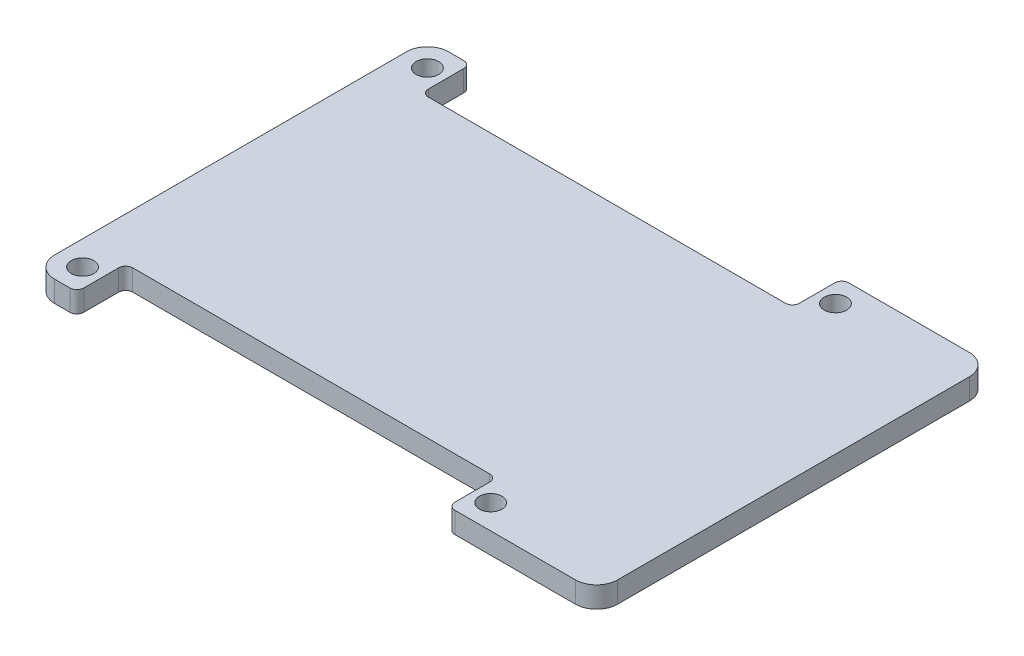
ISO-10303-21;
HEADER;
FILE_DESCRIPTION(('STEP AP214'),'2;1');
FILE_NAME('part.step','',(''),(''),'','','');
FILE_SCHEMA(('AUTOMOTIVE_DESIGN { 1 0 10303 214 1 1 1 1 }'));
ENDSEC;
DATA;
#1=APPLICATION_CONTEXT('core data for automotive mechanical design processes');
#2=APPLICATION_PROTOCOL_DEFINITION('international standard','automotive_design',2000,#1);
#3=PRODUCT_CONTEXT('',#1,'mechanical');
#4=PRODUCT('Part','Part','',(#3));
#5=PRODUCT_RELATED_PRODUCT_CATEGORY('part','',(#4));
#6=PRODUCT_DEFINITION_FORMATION('','',#4);
#7=PRODUCT_DEFINITION_CONTEXT('part definition',#1,'design');
#8=PRODUCT_DEFINITION('design','',#6,#7);
#9=PRODUCT_DEFINITION_SHAPE('','',#8);
#10=(LENGTH_UNIT() NAMED_UNIT(*) SI_UNIT(.MILLI.,.METRE.));
#11=(NAMED_UNIT(*) PLANE_ANGLE_UNIT() SI_UNIT($,.RADIAN.));
#12=(NAMED_UNIT(*) SI_UNIT($,.STERADIAN.) SOLID_ANGLE_UNIT());
#13=UNCERTAINTY_MEASURE_WITH_UNIT(LENGTH_MEASURE(1.E-05),#10,'distance_accuracy_value','');
#14=(GEOMETRIC_REPRESENTATION_CONTEXT(3) GLOBAL_UNCERTAINTY_ASSIGNED_CONTEXT((#13)) GLOBAL_UNIT_ASSIGNED_CONTEXT((#10,
#11,#12)) REPRESENTATION_CONTEXT('',''));
#15=CARTESIAN_POINT('',(0.,0.,0.));
#16=DIRECTION('',(0.,0.,1.));
#17=DIRECTION('',(1.,0.,0.));
#18=AXIS2_PLACEMENT_3D('',#15,#16,#17);
#19=CARTESIAN_POINT('',(-77.0217231267692,3.,-21.4026703774337));
#20=DIRECTION('',(0.,1.,0.));
#21=DIRECTION('',(0.,0.,1.));
#22=AXIS2_PLACEMENT_3D('',#19,#20,#21);
#23=PLANE('',#22);
#24=CARTESIAN_POINT('',(-18.5283322199872,3.,28.1136567752183));
#25=DIRECTION('',(0.,1.,0.));
#26=DIRECTION('',(0.,0.,1.));
#27=AXIS2_PLACEMENT_3D('',#24,#25,#26);
#28=CIRCLE('',#27,1.6);
#29=CARTESIAN_POINT('',(-18.5283322199872,3.,29.7136567752183));
#30=VERTEX_POINT('',#29);
#31=EDGE_CURVE('E480',#30,#30,#28,.T.);
#32=ORIENTED_EDGE('',*,*,#31,.F.);
#33=EDGE_LOOP('',(#32));
#34=FACE_BOUND('',#33,.T.);
#35=CARTESIAN_POINT('',(-76.5284846202892,3.,-20.8867242255417));
#36=DIRECTION('',(0.,1.,0.));
#37=DIRECTION('',(0.,0.,1.));
#38=AXIS2_PLACEMENT_3D('',#35,#36,#37);
#39=CIRCLE('',#38,1.6);
#40=CARTESIAN_POINT('',(-76.5284846202892,3.,-19.2867242255417));
#41=VERTEX_POINT('',#40);
#42=EDGE_CURVE('E248',#41,#41,#39,.T.);
#43=ORIENTED_EDGE('',*,*,#42,.F.);
#44=EDGE_LOOP('',(#43));
#45=FACE_BOUND('',#44,.T.);
#46=CARTESIAN_POINT('',(-77.0217231267692,3.,-21.4026703774337));
#47=DIRECTION('',(0.,1.,0.));
#48=DIRECTION('',(0.,0.,1.));
#49=AXIS2_PLACEMENT_3D('',#46,#47,#48);
#50=CIRCLE('',#49,2.98730505461);
#51=CARTESIAN_POINT('',(-77.0217231267692,3.,-24.3899754320437));
#52=VERTEX_POINT('',#51);
#53=CARTESIAN_POINT('',(-80.0090281813792,3.,-21.4026703774337));
#54=VERTEX_POINT('',#53);
#55=EDGE_CURVE('E314',#52,#54,#50,.T.);
#56=ORIENTED_EDGE('',*,*,#55,.T.);
#57=DIRECTION('',(0.,0.,1.));
#58=VECTOR('',#57,1.);
#59=CARTESIAN_POINT('',(-80.0090281813792,3.,-21.4026703774337));
#60=LINE('',#59,#58);
#61=CARTESIAN_POINT('',(-80.0090281813792,3.,28.6044314767683));
#62=VERTEX_POINT('',#61);
#63=EDGE_CURVE('E152',#54,#62,#60,.T.);
#64=ORIENTED_EDGE('',*,*,#63,.T.);
#65=CARTESIAN_POINT('',(-77.0217231267692,3.,28.6044314767683));
#66=DIRECTION('',(0.,1.,0.));
#67=DIRECTION('',(0.,0.,1.));
#68=AXIS2_PLACEMENT_3D('',#65,#66,#67);
#69=CIRCLE('',#68,2.98730505460999);
#70=CARTESIAN_POINT('',(-77.0217231267692,3.,31.5917365313783));
#71=VERTEX_POINT('',#70);
#72=EDGE_CURVE('E399',#62,#71,#69,.T.);
#73=ORIENTED_EDGE('',*,*,#72,.T.);
#74=DIRECTION('',(1.,0.,0.));
#75=VECTOR('',#74,1.);
#76=CARTESIAN_POINT('',(-77.0217231267692,3.,31.5917365313783));
#77=LINE('',#76,#75);
#78=CARTESIAN_POINT('',(-74.8747309147499,3.,31.5917365313783));
#79=VERTEX_POINT('',#78);
#80=EDGE_CURVE('E419',#71,#79,#77,.T.);
#81=ORIENTED_EDGE('',*,*,#80,.T.);
#82=CARTESIAN_POINT('',(-74.8747309147499,3.,30.5917365313783));
#83=DIRECTION('',(0.,1.,0.));
#84=DIRECTION('',(0.,0.,1.));
#85=AXIS2_PLACEMENT_3D('',#82,#83,#84);
#86=CIRCLE('',#85,1.);
#87=CARTESIAN_POINT('',(-73.8747309147499,3.,30.5917365313783));
#88=VERTEX_POINT('',#87);
#89=EDGE_CURVE('E415',#79,#88,#86,.T.);
#90=ORIENTED_EDGE('',*,*,#89,.T.);
#91=DIRECTION('',(0.,0.,-1.));
#92=VECTOR('',#91,1.);
#93=CARTESIAN_POINT('',(-73.8747309147499,3.,30.5917365313783));
#94=LINE('',#93,#92);
#95=CARTESIAN_POINT('',(-73.8747309147499,3.,25.6450286497662));
#96=VERTEX_POINT('',#95);
#97=EDGE_CURVE('E418',#88,#96,#94,.T.);
#98=ORIENTED_EDGE('',*,*,#97,.T.);
#99=CARTESIAN_POINT('',(-72.8747309147499,3.,25.6450286497662));
#100=DIRECTION('',(0.,-1.,0.));
#101=DIRECTION('',(0.,0.,-1.));
#102=AXIS2_PLACEMENT_3D('',#99,#100,#101);
#103=CIRCLE('',#102,1.);
#104=CARTESIAN_POINT('',(-72.8747309147499,3.,24.6450286497662));
#105=VERTEX_POINT('',#104);
#106=EDGE_CURVE('E424',#96,#105,#103,.T.);
#107=ORIENTED_EDGE('',*,*,#106,.T.);
#108=DIRECTION('',(1.,0.,0.));
#109=VECTOR('',#108,1.);
#110=CARTESIAN_POINT('',(-72.8747309147499,3.,24.6450286497662));
#111=LINE('',#110,#109);
#112=CARTESIAN_POINT('',(-22.1346281962434,3.,24.6450286497662));
#113=VERTEX_POINT('',#112);
#114=EDGE_CURVE('E432',#105,#113,#111,.T.);
#115=ORIENTED_EDGE('',*,*,#114,.T.);
#116=CARTESIAN_POINT('',(-22.1346281962434,3.,25.6450286497662));
#117=DIRECTION('',(0.,-1.,0.));
#118=DIRECTION('',(0.,0.,-1.));
#119=AXIS2_PLACEMENT_3D('',#116,#117,#118);
#120=CIRCLE('',#119,1.);
#121=CARTESIAN_POINT('',(-21.1346281962434,3.,25.6450286497662));
#122=VERTEX_POINT('',#121);
#123=EDGE_CURVE('E434',#113,#122,#120,.T.);
#124=ORIENTED_EDGE('',*,*,#123,.T.);
#125=DIRECTION('',(0.,0.,1.));
#126=VECTOR('',#125,1.);
#127=CARTESIAN_POINT('',(-21.1346281962434,3.,25.6450286497662));
#128=LINE('',#127,#126);
#129=CARTESIAN_POINT('',(-21.1346281962434,3.,30.5917365313783));
#130=VERTEX_POINT('',#129);
#131=EDGE_CURVE('E437',#122,#130,#128,.T.);
#132=ORIENTED_EDGE('',*,*,#131,.T.);
#133=CARTESIAN_POINT('',(-20.1346281962434,3.,30.5917365313783));
#134=DIRECTION('',(0.,1.,0.));
#135=DIRECTION('',(0.,0.,1.));
#136=AXIS2_PLACEMENT_3D('',#133,#134,#135);
#137=CIRCLE('',#136,1.);
#138=CARTESIAN_POINT('',(-20.1346281962434,3.,31.5917365313783));
#139=VERTEX_POINT('',#138);
#140=EDGE_CURVE('E440',#130,#139,#137,.T.);
#141=ORIENTED_EDGE('',*,*,#140,.T.);
#142=DIRECTION('',(1.,0.,0.));
#143=VECTOR('',#142,1.);
#144=CARTESIAN_POINT('',(-20.1346281962434,3.,31.5917365313783));
#145=LINE('',#144,#143);
#146=CARTESIAN_POINT('',(-3.00902818137926,3.,31.5917365313783));
#147=VERTEX_POINT('',#146);
#148=EDGE_CURVE('E443',#139,#147,#145,.T.);
#149=ORIENTED_EDGE('',*,*,#148,.T.);
#150=CARTESIAN_POINT('',(-3.00902818137924,3.,28.5917365313783));
#151=DIRECTION('',(0.,1.,0.));
#152=DIRECTION('',(0.,0.,-1.));
#153=AXIS2_PLACEMENT_3D('',#150,#151,#152);
#154=CIRCLE('',#153,3.);
#155=CARTESIAN_POINT('',(-0.00902818137923965,3.,28.5917365313783));
#156=VERTEX_POINT('',#155);
#157=EDGE_CURVE('E446',#147,#156,#154,.T.);
#158=ORIENTED_EDGE('',*,*,#157,.T.);
#159=DIRECTION('',(0.,0.,-1.));
#160=VECTOR('',#159,1.);
#161=CARTESIAN_POINT('',(-0.00902818137923922,3.,21.7604869984036));
#162=LINE('',#161,#160);
#163=CARTESIAN_POINT('',(-0.00902818137923922,3.,-21.3899754320436));
#164=VERTEX_POINT('',#163);
#165=EDGE_CURVE('E449',#156,#164,#162,.T.);
#166=ORIENTED_EDGE('',*,*,#165,.T.);
#167=CARTESIAN_POINT('',(-3.00902818137924,3.,-21.3899754320437));
#168=DIRECTION('',(0.,1.,0.));
#169=DIRECTION('',(0.,0.,1.));
#170=AXIS2_PLACEMENT_3D('',#167,#168,#169);
#171=CIRCLE('',#170,3.);
#172=CARTESIAN_POINT('',(-3.00902818137926,3.,-24.3899754320437));
#173=VERTEX_POINT('',#172);
#174=EDGE_CURVE('E452',#164,#173,#171,.T.);
#175=ORIENTED_EDGE('',*,*,#174,.T.);
#176=DIRECTION('',(-1.,0.,0.));
#177=VECTOR('',#176,1.);
#178=CARTESIAN_POINT('',(-3.00902818137926,3.,-24.3899754320437));
#179=LINE('',#178,#177);
#180=CARTESIAN_POINT('',(-20.1346281962434,3.,-24.3899754320437));
#181=VERTEX_POINT('',#180);
#182=EDGE_CURVE('E455',#173,#181,#179,.T.);
#183=ORIENTED_EDGE('',*,*,#182,.T.);
#184=CARTESIAN_POINT('',(-20.1346281962434,3.,-23.3899754320437));
#185=DIRECTION('',(0.,1.,0.));
#186=DIRECTION('',(0.,0.,-1.));
#187=AXIS2_PLACEMENT_3D('',#184,#185,#186);
#188=CIRCLE('',#187,1.);
#189=CARTESIAN_POINT('',(-21.1346281962434,3.,-23.3899754320437));
#190=VERTEX_POINT('',#189);
#191=EDGE_CURVE('E458',#181,#190,#188,.T.);
#192=ORIENTED_EDGE('',*,*,#191,.T.);
#193=DIRECTION('',(0.,0.,1.));
#194=VECTOR('',#193,1.);
#195=CARTESIAN_POINT('',(-21.1346281962434,3.,-23.3899754320437));
#196=LINE('',#195,#194);
#197=CARTESIAN_POINT('',(-21.1346281962434,3.,-18.3777360046756));
#198=VERTEX_POINT('',#197);
#199=EDGE_CURVE('E461',#190,#198,#196,.T.);
#200=ORIENTED_EDGE('',*,*,#199,.T.);
#201=CARTESIAN_POINT('',(-22.1346281962434,3.,-18.3777360046756));
#202=DIRECTION('',(0.,-1.,0.));
#203=DIRECTION('',(0.,0.,1.));
#204=AXIS2_PLACEMENT_3D('',#201,#202,#203);
#205=CIRCLE('',#204,1.);
#206=CARTESIAN_POINT('',(-22.1346281962434,3.,-17.3777360046756));
#207=VERTEX_POINT('',#206);
#208=EDGE_CURVE('E464',#198,#207,#205,.T.);
#209=ORIENTED_EDGE('',*,*,#208,.T.);
#210=DIRECTION('',(-1.,0.,0.));
#211=VECTOR('',#210,1.);
#212=CARTESIAN_POINT('',(-22.1346281962434,3.,-17.3777360046756));
#213=LINE('',#212,#211);
#214=CARTESIAN_POINT('',(-72.8747309147499,3.,-17.3777360046756));
#215=VERTEX_POINT('',#214);
#216=EDGE_CURVE('E467',#207,#215,#213,.T.);
#217=ORIENTED_EDGE('',*,*,#216,.T.);
#218=CARTESIAN_POINT('',(-72.8747309147499,3.,-18.3777360046756));
#219=DIRECTION('',(0.,-1.,0.));
#220=DIRECTION('',(0.,0.,1.));
#221=AXIS2_PLACEMENT_3D('',#218,#219,#220);
#222=CIRCLE('',#221,1.);
#223=CARTESIAN_POINT('',(-73.8747309147499,3.,-18.3777360046756));
#224=VERTEX_POINT('',#223);
#225=EDGE_CURVE('E219',#215,#224,#222,.T.);
#226=ORIENTED_EDGE('',*,*,#225,.T.);
#227=DIRECTION('',(0.,0.,-1.));
#228=VECTOR('',#227,1.);
#229=CARTESIAN_POINT('',(-73.8747309147499,3.,-18.3777360046756));
#230=LINE('',#229,#228);
#231=CARTESIAN_POINT('',(-73.8747309147499,3.,-23.3899754320437));
#232=VERTEX_POINT('',#231);
#233=EDGE_CURVE('E213',#224,#232,#230,.T.);
#234=ORIENTED_EDGE('',*,*,#233,.T.);
#235=CARTESIAN_POINT('',(-74.8747309147499,3.,-23.3899754320437));
#236=DIRECTION('',(0.,1.,0.));
#237=DIRECTION('',(0.,0.,-1.));
#238=AXIS2_PLACEMENT_3D('',#235,#236,#237);
#239=CIRCLE('',#238,1.);
#240=CARTESIAN_POINT('',(-74.8747309147499,3.,-24.3899754320437));
#241=VERTEX_POINT('',#240);
#242=EDGE_CURVE('E217',#232,#241,#239,.T.);
#243=ORIENTED_EDGE('',*,*,#242,.T.);
#244=DIRECTION('',(-1.,0.,0.));
#245=VECTOR('',#244,1.);
#246=CARTESIAN_POINT('',(-74.8747309147499,3.,-24.3899754320437));
#247=LINE('',#246,#245);
#248=EDGE_CURVE('E61',#241,#52,#247,.T.);
#249=ORIENTED_EDGE('',*,*,#248,.T.);
#250=EDGE_LOOP('',(#56,#64,#73,#81,#90,#98,#107,#115,#124,#132,#141,#149,#158,#166,#175,#183,
#192,#200,#209,#217,#226,#234,#243,#249));
#251=FACE_BOUND('',#250,.T.);
#252=CARTESIAN_POINT('',(-18.5285862204952,3.,-20.8865972252877));
#253=DIRECTION('',(0.,1.,0.));
#254=DIRECTION('',(0.,0.,1.));
#255=AXIS2_PLACEMENT_3D('',#252,#253,#254);
#256=CIRCLE('',#255,1.6);
#257=CARTESIAN_POINT('',(-18.5285862204952,3.,-19.2865972252877));
#258=VERTEX_POINT('',#257);
#259=EDGE_CURVE('E473',#258,#258,#256,.T.);
#260=ORIENTED_EDGE('',*,*,#259,.F.);
#261=EDGE_LOOP('',(#260));
#262=FACE_BOUND('',#261,.T.);
#263=CARTESIAN_POINT('',(-76.5283322199792,3.,28.1135297749583));
#264=DIRECTION('',(0.,1.,0.));
#265=DIRECTION('',(0.,0.,1.));
#266=AXIS2_PLACEMENT_3D('',#263,#264,#265);
#267=CIRCLE('',#266,1.6);
#268=CARTESIAN_POINT('',(-76.5283322199792,3.,29.7135297749583));
#269=VERTEX_POINT('',#268);
#270=EDGE_CURVE('E486',#269,#269,#267,.T.);
#271=ORIENTED_EDGE('',*,*,#270,.F.);
#272=EDGE_LOOP('',(#271));
#273=FACE_BOUND('',#272,.T.);
#274=ADVANCED_FACE('F43',(#34,#45,#251,#262,#273),#23,.T.);
#275=CARTESIAN_POINT('',(-77.0217231267692,0.,-21.4026703774337));
#276=DIRECTION('',(0.,1.,0.));
#277=DIRECTION('',(0.,0.,1.));
#278=AXIS2_PLACEMENT_3D('',#275,#276,#277);
#279=PLANE('',#278);
#280=CARTESIAN_POINT('',(-77.0217231267692,0.,-21.4026703774337));
#281=DIRECTION('',(0.,1.,0.));
#282=DIRECTION('',(0.,0.,1.));
#283=AXIS2_PLACEMENT_3D('',#280,#281,#282);
#284=CIRCLE('',#283,2.98730505461);
#285=CARTESIAN_POINT('',(-77.0217231267692,0.,-24.3899754320437));
#286=VERTEX_POINT('',#285);
#287=CARTESIAN_POINT('',(-80.0090281813792,0.,-21.4026703774337));
#288=VERTEX_POINT('',#287);
#289=EDGE_CURVE('E243',#286,#288,#284,.T.);
#290=ORIENTED_EDGE('',*,*,#289,.F.);
#291=DIRECTION('',(-1.,0.,0.));
#292=VECTOR('',#291,1.);
#293=CARTESIAN_POINT('',(-74.8747309147499,0.,-24.3899754320437));
#294=LINE('',#293,#292);
#295=CARTESIAN_POINT('',(-74.8747309147499,0.,-24.3899754320437));
#296=VERTEX_POINT('',#295);
#297=EDGE_CURVE('E144',#296,#286,#294,.T.);
#298=ORIENTED_EDGE('',*,*,#297,.F.);
#299=CARTESIAN_POINT('',(-74.8747309147499,0.,-23.3899754320437));
#300=DIRECTION('',(0.,1.,0.));
#301=DIRECTION('',(0.,0.,-1.));
#302=AXIS2_PLACEMENT_3D('',#299,#300,#301);
#303=CIRCLE('',#302,1.);
#304=CARTESIAN_POINT('',(-73.8747309147499,0.,-23.3899754320437));
#305=VERTEX_POINT('',#304);
#306=EDGE_CURVE('E138',#305,#296,#303,.T.);
#307=ORIENTED_EDGE('',*,*,#306,.F.);
#308=DIRECTION('',(0.,0.,-1.));
#309=VECTOR('',#308,1.);
#310=CARTESIAN_POINT('',(-73.8747309147499,0.,-18.3777360046756));
#311=LINE('',#310,#309);
#312=CARTESIAN_POINT('',(-73.8747309147499,0.,-18.3777360046756));
#313=VERTEX_POINT('',#312);
#314=EDGE_CURVE('E228',#313,#305,#311,.T.);
#315=ORIENTED_EDGE('',*,*,#314,.F.);
#316=CARTESIAN_POINT('',(-72.8747309147499,0.,-18.3777360046756));
#317=DIRECTION('',(0.,-1.,0.));
#318=DIRECTION('',(0.,0.,1.));
#319=AXIS2_PLACEMENT_3D('',#316,#317,#318);
#320=CIRCLE('',#319,1.);
#321=CARTESIAN_POINT('',(-72.8747309147499,0.,-17.3777360046756));
#322=VERTEX_POINT('',#321);
#323=EDGE_CURVE('E306',#322,#313,#320,.T.);
#324=ORIENTED_EDGE('',*,*,#323,.F.);
#325=DIRECTION('',(-1.,0.,0.));
#326=VECTOR('',#325,1.);
#327=CARTESIAN_POINT('',(-22.1346281962434,0.,-17.3777360046756));
#328=LINE('',#327,#326);
#329=CARTESIAN_POINT('',(-22.1346281962434,0.,-17.3777360046756));
#330=VERTEX_POINT('',#329);
#331=EDGE_CURVE('E303',#330,#322,#328,.T.);
#332=ORIENTED_EDGE('',*,*,#331,.F.);
#333=CARTESIAN_POINT('',(-22.1346281962434,0.,-18.3777360046756));
#334=DIRECTION('',(0.,-1.,0.));
#335=DIRECTION('',(0.,0.,1.));
#336=AXIS2_PLACEMENT_3D('',#333,#334,#335);
#337=CIRCLE('',#336,1.);
#338=CARTESIAN_POINT('',(-21.1346281962434,0.,-18.3777360046756));
#339=VERTEX_POINT('',#338);
#340=EDGE_CURVE('E300',#339,#330,#337,.T.);
#341=ORIENTED_EDGE('',*,*,#340,.F.);
#342=DIRECTION('',(0.,0.,1.));
#343=VECTOR('',#342,1.);
#344=CARTESIAN_POINT('',(-21.1346281962434,0.,-23.3899754320437));
#345=LINE('',#344,#343);
#346=CARTESIAN_POINT('',(-21.1346281962434,0.,-23.3899754320437));
#347=VERTEX_POINT('',#346);
#348=EDGE_CURVE('E297',#347,#339,#345,.T.);
#349=ORIENTED_EDGE('',*,*,#348,.F.);
#350=CARTESIAN_POINT('',(-20.1346281962434,0.,-23.3899754320437));
#351=DIRECTION('',(0.,1.,0.));
#352=DIRECTION('',(0.,0.,-1.));
#353=AXIS2_PLACEMENT_3D('',#350,#351,#352);
#354=CIRCLE('',#353,1.);
#355=CARTESIAN_POINT('',(-20.1346281962434,0.,-24.3899754320437));
#356=VERTEX_POINT('',#355);
#357=EDGE_CURVE('E294',#356,#347,#354,.T.);
#358=ORIENTED_EDGE('',*,*,#357,.F.);
#359=DIRECTION('',(-1.,0.,0.));
#360=VECTOR('',#359,1.);
#361=CARTESIAN_POINT('',(-3.00902818137926,0.,-24.3899754320437));
#362=LINE('',#361,#360);
#363=CARTESIAN_POINT('',(-3.00902818137926,0.,-24.3899754320437));
#364=VERTEX_POINT('',#363);
#365=EDGE_CURVE('E291',#364,#356,#362,.T.);
#366=ORIENTED_EDGE('',*,*,#365,.F.);
#367=CARTESIAN_POINT('',(-3.00902818137924,0.,-21.3899754320437));
#368=DIRECTION('',(0.,1.,0.));
#369=DIRECTION('',(0.,0.,1.));
#370=AXIS2_PLACEMENT_3D('',#367,#368,#369);
#371=CIRCLE('',#370,3.);
#372=CARTESIAN_POINT('',(-0.00902818137923922,0.,-21.3899754320436));
#373=VERTEX_POINT('',#372);
#374=EDGE_CURVE('E288',#373,#364,#371,.T.);
#375=ORIENTED_EDGE('',*,*,#374,.F.);
#376=DIRECTION('',(0.,0.,-1.));
#377=VECTOR('',#376,1.);
#378=CARTESIAN_POINT('',(-0.00902818137923922,0.,21.7604869984036));
#379=LINE('',#378,#377);
#380=CARTESIAN_POINT('',(-0.00902818137923965,0.,28.5917365313783));
#381=VERTEX_POINT('',#380);
#382=EDGE_CURVE('E285',#381,#373,#379,.T.);
#383=ORIENTED_EDGE('',*,*,#382,.F.);
#384=CARTESIAN_POINT('',(-3.00902818137924,0.,28.5917365313783));
#385=DIRECTION('',(0.,1.,0.));
#386=DIRECTION('',(0.,0.,-1.));
#387=AXIS2_PLACEMENT_3D('',#384,#385,#386);
#388=CIRCLE('',#387,3.);
#389=CARTESIAN_POINT('',(-3.00902818137926,0.,31.5917365313783));
#390=VERTEX_POINT('',#389);
#391=EDGE_CURVE('E281',#390,#381,#388,.T.);
#392=ORIENTED_EDGE('',*,*,#391,.F.);
#393=DIRECTION('',(1.,0.,0.));
#394=VECTOR('',#393,1.);
#395=CARTESIAN_POINT('',(-20.1346281962434,0.,31.5917365313783));
#396=LINE('',#395,#394);
#397=CARTESIAN_POINT('',(-20.1346281962434,0.,31.5917365313783));
#398=VERTEX_POINT('',#397);
#399=EDGE_CURVE('E278',#398,#390,#396,.T.);
#400=ORIENTED_EDGE('',*,*,#399,.F.);
#401=CARTESIAN_POINT('',(-20.1346281962434,0.,30.5917365313783));
#402=DIRECTION('',(0.,1.,0.));
#403=DIRECTION('',(0.,0.,1.));
#404=AXIS2_PLACEMENT_3D('',#401,#402,#403);
#405=CIRCLE('',#404,1.);
#406=CARTESIAN_POINT('',(-21.1346281962434,0.,30.5917365313783));
#407=VERTEX_POINT('',#406);
#408=EDGE_CURVE('E275',#407,#398,#405,.T.);
#409=ORIENTED_EDGE('',*,*,#408,.F.);
#410=DIRECTION('',(0.,0.,1.));
#411=VECTOR('',#410,1.);
#412=CARTESIAN_POINT('',(-21.1346281962434,0.,25.6450286497662));
#413=LINE('',#412,#411);
#414=CARTESIAN_POINT('',(-21.1346281962434,0.,25.6450286497662));
#415=VERTEX_POINT('',#414);
#416=EDGE_CURVE('E272',#415,#407,#413,.T.);
#417=ORIENTED_EDGE('',*,*,#416,.F.);
#418=CARTESIAN_POINT('',(-22.1346281962434,0.,25.6450286497662));
#419=DIRECTION('',(0.,-1.,0.));
#420=DIRECTION('',(0.,0.,-1.));
#421=AXIS2_PLACEMENT_3D('',#418,#419,#420);
#422=CIRCLE('',#421,1.);
#423=CARTESIAN_POINT('',(-22.1346281962434,0.,24.6450286497662));
#424=VERTEX_POINT('',#423);
#425=EDGE_CURVE('E269',#424,#415,#422,.T.);
#426=ORIENTED_EDGE('',*,*,#425,.F.);
#427=DIRECTION('',(1.,0.,0.));
#428=VECTOR('',#427,1.);
#429=CARTESIAN_POINT('',(-72.8747309147499,0.,24.6450286497662));
#430=LINE('',#429,#428);
#431=CARTESIAN_POINT('',(-72.8747309147499,0.,24.6450286497662));
#432=VERTEX_POINT('',#431);
#433=EDGE_CURVE('E266',#432,#424,#430,.T.);
#434=ORIENTED_EDGE('',*,*,#433,.F.);
#435=CARTESIAN_POINT('',(-72.8747309147499,0.,25.6450286497662));
#436=DIRECTION('',(0.,-1.,0.));
#437=DIRECTION('',(0.,0.,-1.));
#438=AXIS2_PLACEMENT_3D('',#435,#436,#437);
#439=CIRCLE('',#438,1.);
#440=CARTESIAN_POINT('',(-73.8747309147499,0.,25.6450286497662));
#441=VERTEX_POINT('',#440);
#442=EDGE_CURVE('E263',#441,#432,#439,.T.);
#443=ORIENTED_EDGE('',*,*,#442,.F.);
#444=DIRECTION('',(0.,0.,-1.));
#445=VECTOR('',#444,1.);
#446=CARTESIAN_POINT('',(-73.8747309147499,0.,30.5917365313783));
#447=LINE('',#446,#445);
#448=CARTESIAN_POINT('',(-73.8747309147499,0.,30.5917365313783));
#449=VERTEX_POINT('',#448);
#450=EDGE_CURVE('E260',#449,#441,#447,.T.);
#451=ORIENTED_EDGE('',*,*,#450,.F.);
#452=CARTESIAN_POINT('',(-74.8747309147499,0.,30.5917365313783));
#453=DIRECTION('',(0.,1.,0.));
#454=DIRECTION('',(0.,0.,1.));
#455=AXIS2_PLACEMENT_3D('',#452,#453,#454);
#456=CIRCLE('',#455,1.);
#457=CARTESIAN_POINT('',(-74.8747309147499,0.,31.5917365313783));
#458=VERTEX_POINT('',#457);
#459=EDGE_CURVE('E257',#458,#449,#456,.T.);
#460=ORIENTED_EDGE('',*,*,#459,.F.);
#461=DIRECTION('',(1.,0.,0.));
#462=VECTOR('',#461,1.);
#463=CARTESIAN_POINT('',(-77.0217231267692,0.,31.5917365313783));
#464=LINE('',#463,#462);
#465=CARTESIAN_POINT('',(-77.0217231267692,0.,31.5917365313783));
#466=VERTEX_POINT('',#465);
#467=EDGE_CURVE('E254',#466,#458,#464,.T.);
#468=ORIENTED_EDGE('',*,*,#467,.F.);
#469=CARTESIAN_POINT('',(-77.0217231267692,0.,28.6044314767683));
#470=DIRECTION('',(0.,1.,0.));
#471=DIRECTION('',(0.,0.,1.));
#472=AXIS2_PLACEMENT_3D('',#469,#470,#471);
#473=CIRCLE('',#472,2.98730505460999);
#474=CARTESIAN_POINT('',(-80.0090281813792,0.,28.6044314767683));
#475=VERTEX_POINT('',#474);
#476=EDGE_CURVE('E251',#475,#466,#473,.T.);
#477=ORIENTED_EDGE('',*,*,#476,.F.);
#478=DIRECTION('',(0.,0.,1.));
#479=VECTOR('',#478,1.);
#480=CARTESIAN_POINT('',(-80.0090281813792,0.,-21.4026703774337));
#481=LINE('',#480,#479);
#482=EDGE_CURVE('E247',#288,#475,#481,.T.);
#483=ORIENTED_EDGE('',*,*,#482,.F.);
#484=EDGE_LOOP('',(#290,#298,#307,#315,#324,#332,#341,#349,#358,#366,#375,#383,#392,#400,#409,
#417,#426,#434,#443,#451,#460,#468,#477,#483));
#485=FACE_BOUND('',#484,.T.);
#486=CARTESIAN_POINT('',(-76.5284846202892,0.,-20.8867242255417));
#487=DIRECTION('',(0.,1.,0.));
#488=DIRECTION('',(0.,0.,1.));
#489=AXIS2_PLACEMENT_3D('',#486,#487,#488);
#490=CIRCLE('',#489,1.6);
#491=CARTESIAN_POINT('',(-76.5284846202892,0.,-19.2867242255417));
#492=VERTEX_POINT('',#491);
#493=EDGE_CURVE('E475',#492,#492,#490,.T.);
#494=ORIENTED_EDGE('',*,*,#493,.T.);
#495=EDGE_LOOP('',(#494));
#496=FACE_BOUND('',#495,.T.);
#497=CARTESIAN_POINT('',(-18.5285862204952,0.,-20.8865972252877));
#498=DIRECTION('',(0.,1.,0.));
#499=DIRECTION('',(0.,0.,1.));
#500=AXIS2_PLACEMENT_3D('',#497,#498,#499);
#501=CIRCLE('',#500,1.6);
#502=CARTESIAN_POINT('',(-18.5285862204952,0.,-19.2865972252877));
#503=VERTEX_POINT('',#502);
#504=EDGE_CURVE('E476',#503,#503,#501,.T.);
#505=ORIENTED_EDGE('',*,*,#504,.T.);
#506=EDGE_LOOP('',(#505));
#507=FACE_BOUND('',#506,.T.);
#508=CARTESIAN_POINT('',(-18.5283322199872,0.,28.1136567752183));
#509=DIRECTION('',(0.,1.,0.));
#510=DIRECTION('',(0.,0.,1.));
#511=AXIS2_PLACEMENT_3D('',#508,#509,#510);
#512=CIRCLE('',#511,1.6);
#513=CARTESIAN_POINT('',(-18.5283322199872,0.,29.7136567752183));
#514=VERTEX_POINT('',#513);
#515=EDGE_CURVE('E490',#514,#514,#512,.T.);
#516=ORIENTED_EDGE('',*,*,#515,.T.);
#517=EDGE_LOOP('',(#516));
#518=FACE_BOUND('',#517,.T.);
#519=CARTESIAN_POINT('',(-76.5283322199792,0.,28.1135297749583));
#520=DIRECTION('',(0.,1.,0.));
#521=DIRECTION('',(0.,0.,1.));
#522=AXIS2_PLACEMENT_3D('',#519,#520,#521);
#523=CIRCLE('',#522,1.6);
#524=CARTESIAN_POINT('',(-76.5283322199792,0.,29.7135297749583));
#525=VERTEX_POINT('',#524);
#526=EDGE_CURVE('E484',#525,#525,#523,.T.);
#527=ORIENTED_EDGE('',*,*,#526,.T.);
#528=EDGE_LOOP('',(#527));
#529=FACE_BOUND('',#528,.T.);
#530=ADVANCED_FACE('F403',(#485,#496,#507,#518,#529),#279,.F.);
#531=CARTESIAN_POINT('',(-77.0217231267692,3.,-21.4026703774337));
#532=DIRECTION('',(0.,-1.,0.));
#533=DIRECTION('',(0.,0.,-1.));
#534=AXIS2_PLACEMENT_3D('',#531,#532,#533);
#535=CYLINDRICAL_SURFACE('',#534,2.98730505461);
#536=ORIENTED_EDGE('',*,*,#289,.T.);
#537=DIRECTION('',(0.,-1.,0.));
#538=VECTOR('',#537,1.);
#539=CARTESIAN_POINT('',(-80.0090281813792,3.,-21.4026703774337));
#540=LINE('',#539,#538);
#541=EDGE_CURVE('E11',#54,#288,#540,.T.);
#542=ORIENTED_EDGE('',*,*,#541,.F.);
#543=ORIENTED_EDGE('',*,*,#55,.F.);
#544=DIRECTION('',(0.,-1.,0.));
#545=VECTOR('',#544,1.);
#546=CARTESIAN_POINT('',(-77.0217231267692,3.,-24.3899754320437));
#547=LINE('',#546,#545);
#548=EDGE_CURVE('E239',#52,#286,#547,.T.);
#549=ORIENTED_EDGE('',*,*,#548,.T.);
#550=EDGE_LOOP('',(#536,#542,#543,#549));
#551=FACE_BOUND('',#550,.T.);
#552=ADVANCED_FACE('F45',(#551),#535,.T.);
#553=CARTESIAN_POINT('',(-80.0090281813792,3.,-21.4026703774337));
#554=DIRECTION('',(1.,0.,0.));
#555=DIRECTION('',(0.,0.,-1.));
#556=AXIS2_PLACEMENT_3D('',#553,#554,#555);
#557=PLANE('',#556);
#558=ORIENTED_EDGE('',*,*,#482,.T.);
#559=DIRECTION('',(0.,-1.,0.));
#560=VECTOR('',#559,1.);
#561=CARTESIAN_POINT('',(-80.0090281813792,3.,28.6044314767683));
#562=LINE('',#561,#560);
#563=EDGE_CURVE('E53',#62,#475,#562,.T.);
#564=ORIENTED_EDGE('',*,*,#563,.F.);
#565=ORIENTED_EDGE('',*,*,#63,.F.);
#566=ORIENTED_EDGE('',*,*,#541,.T.);
#567=EDGE_LOOP('',(#558,#564,#565,#566));
#568=FACE_BOUND('',#567,.T.);
#569=ADVANCED_FACE('F619',(#568),#557,.F.);
#570=CARTESIAN_POINT('',(-77.0217231267692,3.,28.6044314767683));
#571=DIRECTION('',(0.,-1.,0.));
#572=DIRECTION('',(0.,0.,-1.));
#573=AXIS2_PLACEMENT_3D('',#570,#571,#572);
#574=CYLINDRICAL_SURFACE('',#573,2.98730505460999);
#575=ORIENTED_EDGE('',*,*,#476,.T.);
#576=DIRECTION('',(0.,-1.,0.));
#577=VECTOR('',#576,1.);
#578=CARTESIAN_POINT('',(-77.0217231267692,3.,31.5917365313783));
#579=LINE('',#578,#577);
#580=EDGE_CURVE('E389',#71,#466,#579,.T.);
#581=ORIENTED_EDGE('',*,*,#580,.F.);
#582=ORIENTED_EDGE('',*,*,#72,.F.);
#583=ORIENTED_EDGE('',*,*,#563,.T.);
#584=EDGE_LOOP('',(#575,#581,#582,#583));
#585=FACE_BOUND('',#584,.T.);
#586=ADVANCED_FACE('F397',(#585),#574,.T.);
#587=CARTESIAN_POINT('',(-77.0217231267692,3.,31.5917365313783));
#588=DIRECTION('',(0.,0.,-1.));
#589=DIRECTION('',(-1.,0.,0.));
#590=AXIS2_PLACEMENT_3D('',#587,#588,#589);
#591=PLANE('',#590);
#592=ORIENTED_EDGE('',*,*,#467,.T.);
#593=DIRECTION('',(0.,-1.,0.));
#594=VECTOR('',#593,1.);
#595=CARTESIAN_POINT('',(-74.8747309147499,3.,31.5917365313783));
#596=LINE('',#595,#594);
#597=EDGE_CURVE('E385',#79,#458,#596,.T.);
#598=ORIENTED_EDGE('',*,*,#597,.F.);
#599=ORIENTED_EDGE('',*,*,#80,.F.);
#600=ORIENTED_EDGE('',*,*,#580,.T.);
#601=EDGE_LOOP('',(#592,#598,#599,#600));
#602=FACE_BOUND('',#601,.T.);
#603=ADVANCED_FACE('F409',(#602),#591,.F.);
#604=CARTESIAN_POINT('',(-74.8747309147499,3.,30.5917365313783));
#605=DIRECTION('',(0.,-1.,0.));
#606=DIRECTION('',(0.,0.,-1.));
#607=AXIS2_PLACEMENT_3D('',#604,#605,#606);
#608=CYLINDRICAL_SURFACE('',#607,1.);
#609=ORIENTED_EDGE('',*,*,#459,.T.);
#610=DIRECTION('',(0.,-1.,0.));
#611=VECTOR('',#610,1.);
#612=CARTESIAN_POINT('',(-73.8747309147499,3.,30.5917365313783));
#613=LINE('',#612,#611);
#614=EDGE_CURVE('E381',#88,#449,#613,.T.);
#615=ORIENTED_EDGE('',*,*,#614,.F.);
#616=ORIENTED_EDGE('',*,*,#89,.F.);
#617=ORIENTED_EDGE('',*,*,#597,.T.);
#618=EDGE_LOOP('',(#609,#615,#616,#617));
#619=FACE_BOUND('',#618,.T.);
#620=ADVANCED_FACE('F413',(#619),#608,.T.);
#621=CARTESIAN_POINT('',(-73.8747309147499,3.,30.5917365313783));
#622=DIRECTION('',(-1.,0.,0.));
#623=DIRECTION('',(0.,0.,1.));
#624=AXIS2_PLACEMENT_3D('',#621,#622,#623);
#625=PLANE('',#624);
#626=ORIENTED_EDGE('',*,*,#450,.T.);
#627=DIRECTION('',(0.,-1.,0.));
#628=VECTOR('',#627,1.);
#629=CARTESIAN_POINT('',(-73.8747309147499,3.,25.6450286497662));
#630=LINE('',#629,#628);
#631=EDGE_CURVE('E377',#96,#441,#630,.T.);
#632=ORIENTED_EDGE('',*,*,#631,.F.);
#633=ORIENTED_EDGE('',*,*,#97,.F.);
#634=ORIENTED_EDGE('',*,*,#614,.T.);
#635=EDGE_LOOP('',(#626,#632,#633,#634));
#636=FACE_BOUND('',#635,.T.);
#637=ADVANCED_FACE('F609',(#636),#625,.F.);
#638=CARTESIAN_POINT('',(-72.8747309147499,3.,25.6450286497662));
#639=DIRECTION('',(0.,-1.,0.));
#640=DIRECTION('',(0.,0.,-1.));
#641=AXIS2_PLACEMENT_3D('',#638,#639,#640);
#642=CYLINDRICAL_SURFACE('',#641,1.);
#643=ORIENTED_EDGE('',*,*,#442,.T.);
#644=DIRECTION('',(0.,-1.,0.));
#645=VECTOR('',#644,1.);
#646=CARTESIAN_POINT('',(-72.8747309147499,3.,24.6450286497662));
#647=LINE('',#646,#645);
#648=EDGE_CURVE('E373',#105,#432,#647,.T.);
#649=ORIENTED_EDGE('',*,*,#648,.F.);
#650=ORIENTED_EDGE('',*,*,#106,.F.);
#651=ORIENTED_EDGE('',*,*,#631,.T.);
#652=EDGE_LOOP('',(#643,#649,#650,#651));
#653=FACE_BOUND('',#652,.T.);
#654=ADVANCED_FACE('F605',(#653),#642,.F.);
#655=CARTESIAN_POINT('',(-72.8747309147499,3.,24.6450286497662));
#656=DIRECTION('',(0.,0.,-1.));
#657=DIRECTION('',(-1.,0.,0.));
#658=AXIS2_PLACEMENT_3D('',#655,#656,#657);
#659=PLANE('',#658);
#660=ORIENTED_EDGE('',*,*,#433,.T.);
#661=DIRECTION('',(0.,-1.,0.));
#662=VECTOR('',#661,1.);
#663=CARTESIAN_POINT('',(-22.1346281962434,3.,24.6450286497662));
#664=LINE('',#663,#662);
#665=EDGE_CURVE('E369',#113,#424,#664,.T.);
#666=ORIENTED_EDGE('',*,*,#665,.F.);
#667=ORIENTED_EDGE('',*,*,#114,.F.);
#668=ORIENTED_EDGE('',*,*,#648,.T.);
#669=EDGE_LOOP('',(#660,#666,#667,#668));
#670=FACE_BOUND('',#669,.T.);
#671=ADVANCED_FACE('F601',(#670),#659,.F.);
#672=CARTESIAN_POINT('',(-22.1346281962434,3.,25.6450286497662));
#673=DIRECTION('',(0.,-1.,0.));
#674=DIRECTION('',(0.,0.,-1.));
#675=AXIS2_PLACEMENT_3D('',#672,#673,#674);
#676=CYLINDRICAL_SURFACE('',#675,1.);
#677=ORIENTED_EDGE('',*,*,#425,.T.);
#678=DIRECTION('',(0.,-1.,0.));
#679=VECTOR('',#678,1.);
#680=CARTESIAN_POINT('',(-21.1346281962434,3.,25.6450286497662));
#681=LINE('',#680,#679);
#682=EDGE_CURVE('E365',#122,#415,#681,.T.);
#683=ORIENTED_EDGE('',*,*,#682,.F.);
#684=ORIENTED_EDGE('',*,*,#123,.F.);
#685=ORIENTED_EDGE('',*,*,#665,.T.);
#686=EDGE_LOOP('',(#677,#683,#684,#685));
#687=FACE_BOUND('',#686,.T.);
#688=ADVANCED_FACE('F597',(#687),#676,.F.);
#689=CARTESIAN_POINT('',(-21.1346281962434,3.,25.6450286497662));
#690=DIRECTION('',(1.,0.,0.));
#691=DIRECTION('',(0.,0.,-1.));
#692=AXIS2_PLACEMENT_3D('',#689,#690,#691);
#693=PLANE('',#692);
#694=ORIENTED_EDGE('',*,*,#416,.T.);
#695=DIRECTION('',(0.,-1.,0.));
#696=VECTOR('',#695,1.);
#697=CARTESIAN_POINT('',(-21.1346281962434,3.,30.5917365313783));
#698=LINE('',#697,#696);
#699=EDGE_CURVE('E361',#130,#407,#698,.T.);
#700=ORIENTED_EDGE('',*,*,#699,.F.);
#701=ORIENTED_EDGE('',*,*,#131,.F.);
#702=ORIENTED_EDGE('',*,*,#682,.T.);
#703=EDGE_LOOP('',(#694,#700,#701,#702));
#704=FACE_BOUND('',#703,.T.);
#705=ADVANCED_FACE('F593',(#704),#693,.F.);
#706=CARTESIAN_POINT('',(-20.1346281962434,3.,30.5917365313783));
#707=DIRECTION('',(0.,-1.,0.));
#708=DIRECTION('',(0.,0.,-1.));
#709=AXIS2_PLACEMENT_3D('',#706,#707,#708);
#710=CYLINDRICAL_SURFACE('',#709,1.);
#711=ORIENTED_EDGE('',*,*,#408,.T.);
#712=DIRECTION('',(0.,-1.,0.));
#713=VECTOR('',#712,1.);
#714=CARTESIAN_POINT('',(-20.1346281962434,3.,31.5917365313783));
#715=LINE('',#714,#713);
#716=EDGE_CURVE('E357',#139,#398,#715,.T.);
#717=ORIENTED_EDGE('',*,*,#716,.F.);
#718=ORIENTED_EDGE('',*,*,#140,.F.);
#719=ORIENTED_EDGE('',*,*,#699,.T.);
#720=EDGE_LOOP('',(#711,#717,#718,#719));
#721=FACE_BOUND('',#720,.T.);
#722=ADVANCED_FACE('F589',(#721),#710,.T.);
#723=CARTESIAN_POINT('',(-20.1346281962434,3.,31.5917365313783));
#724=DIRECTION('',(0.,0.,-1.));
#725=DIRECTION('',(-1.,0.,0.));
#726=AXIS2_PLACEMENT_3D('',#723,#724,#725);
#727=PLANE('',#726);
#728=ORIENTED_EDGE('',*,*,#399,.T.);
#729=DIRECTION('',(0.,-1.,0.));
#730=VECTOR('',#729,1.);
#731=CARTESIAN_POINT('',(-3.00902818137926,3.,31.5917365313783));
#732=LINE('',#731,#730);
#733=EDGE_CURVE('E353',#147,#390,#732,.T.);
#734=ORIENTED_EDGE('',*,*,#733,.F.);
#735=ORIENTED_EDGE('',*,*,#148,.F.);
#736=ORIENTED_EDGE('',*,*,#716,.T.);
#737=EDGE_LOOP('',(#728,#734,#735,#736));
#738=FACE_BOUND('',#737,.T.);
#739=ADVANCED_FACE('F585',(#738),#727,.F.);
#740=CARTESIAN_POINT('',(-3.00902818137924,3.,28.5917365313783));
#741=DIRECTION('',(0.,-1.,0.));
#742=DIRECTION('',(0.,0.,-1.));
#743=AXIS2_PLACEMENT_3D('',#740,#741,#742);
#744=CYLINDRICAL_SURFACE('',#743,3.);
#745=ORIENTED_EDGE('',*,*,#391,.T.);
#746=DIRECTION('',(0.,-1.,0.));
#747=VECTOR('',#746,1.);
#748=CARTESIAN_POINT('',(-0.00902818137923965,3.,28.5917365313783));
#749=LINE('',#748,#747);
#750=EDGE_CURVE('E349',#156,#381,#749,.T.);
#751=ORIENTED_EDGE('',*,*,#750,.F.);
#752=ORIENTED_EDGE('',*,*,#157,.F.);
#753=ORIENTED_EDGE('',*,*,#733,.T.);
#754=EDGE_LOOP('',(#745,#751,#752,#753));
#755=FACE_BOUND('',#754,.T.);
#756=ADVANCED_FACE('F581',(#755),#744,.T.);
#757=CARTESIAN_POINT('',(-0.00902818137923922,3.,21.7604869984036));
#758=DIRECTION('',(-1.,0.,0.));
#759=DIRECTION('',(0.,0.,1.));
#760=AXIS2_PLACEMENT_3D('',#757,#758,#759);
#761=PLANE('',#760);
#762=ORIENTED_EDGE('',*,*,#382,.T.);
#763=DIRECTION('',(0.,-1.,0.));
#764=VECTOR('',#763,1.);
#765=CARTESIAN_POINT('',(-0.00902818137923922,3.,-21.3899754320436));
#766=LINE('',#765,#764);
#767=EDGE_CURVE('E345',#164,#373,#766,.T.);
#768=ORIENTED_EDGE('',*,*,#767,.F.);
#769=ORIENTED_EDGE('',*,*,#165,.F.);
#770=ORIENTED_EDGE('',*,*,#750,.T.);
#771=EDGE_LOOP('',(#762,#768,#769,#770));
#772=FACE_BOUND('',#771,.T.);
#773=ADVANCED_FACE('F577',(#772),#761,.F.);
#774=CARTESIAN_POINT('',(-3.00902818137924,3.,-21.3899754320437));
#775=DIRECTION('',(0.,-1.,0.));
#776=DIRECTION('',(0.,0.,-1.));
#777=AXIS2_PLACEMENT_3D('',#774,#775,#776);
#778=CYLINDRICAL_SURFACE('',#777,3.);
#779=ORIENTED_EDGE('',*,*,#374,.T.);
#780=DIRECTION('',(0.,-1.,0.));
#781=VECTOR('',#780,1.);
#782=CARTESIAN_POINT('',(-3.00902818137926,3.,-24.3899754320437));
#783=LINE('',#782,#781);
#784=EDGE_CURVE('E341',#173,#364,#783,.T.);
#785=ORIENTED_EDGE('',*,*,#784,.F.);
#786=ORIENTED_EDGE('',*,*,#174,.F.);
#787=ORIENTED_EDGE('',*,*,#767,.T.);
#788=EDGE_LOOP('',(#779,#785,#786,#787));
#789=FACE_BOUND('',#788,.T.);
#790=ADVANCED_FACE('F573',(#789),#778,.T.);
#791=CARTESIAN_POINT('',(-3.00902818137926,3.,-24.3899754320437));
#792=DIRECTION('',(0.,0.,1.));
#793=DIRECTION('',(1.,0.,0.));
#794=AXIS2_PLACEMENT_3D('',#791,#792,#793);
#795=PLANE('',#794);
#796=ORIENTED_EDGE('',*,*,#365,.T.);
#797=DIRECTION('',(0.,-1.,0.));
#798=VECTOR('',#797,1.);
#799=CARTESIAN_POINT('',(-20.1346281962434,3.,-24.3899754320437));
#800=LINE('',#799,#798);
#801=EDGE_CURVE('E337',#181,#356,#800,.T.);
#802=ORIENTED_EDGE('',*,*,#801,.F.);
#803=ORIENTED_EDGE('',*,*,#182,.F.);
#804=ORIENTED_EDGE('',*,*,#784,.T.);
#805=EDGE_LOOP('',(#796,#802,#803,#804));
#806=FACE_BOUND('',#805,.T.);
#807=ADVANCED_FACE('F569',(#806),#795,.F.);
#808=CARTESIAN_POINT('',(-20.1346281962434,3.,-23.3899754320437));
#809=DIRECTION('',(0.,-1.,0.));
#810=DIRECTION('',(0.,0.,-1.));
#811=AXIS2_PLACEMENT_3D('',#808,#809,#810);
#812=CYLINDRICAL_SURFACE('',#811,1.);
#813=ORIENTED_EDGE('',*,*,#357,.T.);
#814=DIRECTION('',(0.,-1.,0.));
#815=VECTOR('',#814,1.);
#816=CARTESIAN_POINT('',(-21.1346281962434,3.,-23.3899754320437));
#817=LINE('',#816,#815);
#818=EDGE_CURVE('E333',#190,#347,#817,.T.);
#819=ORIENTED_EDGE('',*,*,#818,.F.);
#820=ORIENTED_EDGE('',*,*,#191,.F.);
#821=ORIENTED_EDGE('',*,*,#801,.T.);
#822=EDGE_LOOP('',(#813,#819,#820,#821));
#823=FACE_BOUND('',#822,.T.);
#824=ADVANCED_FACE('F565',(#823),#812,.T.);
#825=CARTESIAN_POINT('',(-21.1346281962434,3.,-23.3899754320437));
#826=DIRECTION('',(1.,0.,0.));
#827=DIRECTION('',(0.,0.,-1.));
#828=AXIS2_PLACEMENT_3D('',#825,#826,#827);
#829=PLANE('',#828);
#830=ORIENTED_EDGE('',*,*,#348,.T.);
#831=DIRECTION('',(0.,-1.,0.));
#832=VECTOR('',#831,1.);
#833=CARTESIAN_POINT('',(-21.1346281962434,3.,-18.3777360046756));
#834=LINE('',#833,#832);
#835=EDGE_CURVE('E329',#198,#339,#834,.T.);
#836=ORIENTED_EDGE('',*,*,#835,.F.);
#837=ORIENTED_EDGE('',*,*,#199,.F.);
#838=ORIENTED_EDGE('',*,*,#818,.T.);
#839=EDGE_LOOP('',(#830,#836,#837,#838));
#840=FACE_BOUND('',#839,.T.);
#841=ADVANCED_FACE('F561',(#840),#829,.F.);
#842=CARTESIAN_POINT('',(-22.1346281962434,3.,-18.3777360046756));
#843=DIRECTION('',(0.,-1.,0.));
#844=DIRECTION('',(0.,0.,-1.));
#845=AXIS2_PLACEMENT_3D('',#842,#843,#844);
#846=CYLINDRICAL_SURFACE('',#845,1.);
#847=ORIENTED_EDGE('',*,*,#340,.T.);
#848=DIRECTION('',(0.,-1.,0.));
#849=VECTOR('',#848,1.);
#850=CARTESIAN_POINT('',(-22.1346281962434,3.,-17.3777360046756));
#851=LINE('',#850,#849);
#852=EDGE_CURVE('E325',#207,#330,#851,.T.);
#853=ORIENTED_EDGE('',*,*,#852,.F.);
#854=ORIENTED_EDGE('',*,*,#208,.F.);
#855=ORIENTED_EDGE('',*,*,#835,.T.);
#856=EDGE_LOOP('',(#847,#853,#854,#855));
#857=FACE_BOUND('',#856,.T.);
#858=ADVANCED_FACE('F557',(#857),#846,.F.);
#859=CARTESIAN_POINT('',(-22.1346281962434,3.,-17.3777360046756));
#860=DIRECTION('',(0.,0.,1.));
#861=DIRECTION('',(1.,0.,0.));
#862=AXIS2_PLACEMENT_3D('',#859,#860,#861);
#863=PLANE('',#862);
#864=ORIENTED_EDGE('',*,*,#331,.T.);
#865=DIRECTION('',(0.,-1.,0.));
#866=VECTOR('',#865,1.);
#867=CARTESIAN_POINT('',(-72.8747309147499,3.,-17.3777360046756));
#868=LINE('',#867,#866);
#869=EDGE_CURVE('E321',#215,#322,#868,.T.);
#870=ORIENTED_EDGE('',*,*,#869,.F.);
#871=ORIENTED_EDGE('',*,*,#216,.F.);
#872=ORIENTED_EDGE('',*,*,#852,.T.);
#873=EDGE_LOOP('',(#864,#870,#871,#872));
#874=FACE_BOUND('',#873,.T.);
#875=ADVANCED_FACE('F553',(#874),#863,.F.);
#876=CARTESIAN_POINT('',(-72.8747309147499,3.,-18.3777360046756));
#877=DIRECTION('',(0.,-1.,0.));
#878=DIRECTION('',(0.,0.,-1.));
#879=AXIS2_PLACEMENT_3D('',#876,#877,#878);
#880=CYLINDRICAL_SURFACE('',#879,1.);
#881=ORIENTED_EDGE('',*,*,#323,.T.);
#882=DIRECTION('',(0.,-1.,0.));
#883=VECTOR('',#882,1.);
#884=CARTESIAN_POINT('',(-73.8747309147499,3.,-18.3777360046756));
#885=LINE('',#884,#883);
#886=EDGE_CURVE('E230',#224,#313,#885,.T.);
#887=ORIENTED_EDGE('',*,*,#886,.F.);
#888=ORIENTED_EDGE('',*,*,#225,.F.);
#889=ORIENTED_EDGE('',*,*,#869,.T.);
#890=EDGE_LOOP('',(#881,#887,#888,#889));
#891=FACE_BOUND('',#890,.T.);
#892=ADVANCED_FACE('F550',(#891),#880,.F.);
#893=CARTESIAN_POINT('',(-73.8747309147499,3.,-18.3777360046756));
#894=DIRECTION('',(-1.,0.,0.));
#895=DIRECTION('',(0.,0.,1.));
#896=AXIS2_PLACEMENT_3D('',#893,#894,#895);
#897=PLANE('',#896);
#898=ORIENTED_EDGE('',*,*,#314,.T.);
#899=DIRECTION('',(0.,-1.,0.));
#900=VECTOR('',#899,1.);
#901=CARTESIAN_POINT('',(-73.8747309147499,3.,-23.3899754320437));
#902=LINE('',#901,#900);
#903=EDGE_CURVE('E225',#232,#305,#902,.T.);
#904=ORIENTED_EDGE('',*,*,#903,.F.);
#905=ORIENTED_EDGE('',*,*,#233,.F.);
#906=ORIENTED_EDGE('',*,*,#886,.T.);
#907=EDGE_LOOP('',(#898,#904,#905,#906));
#908=FACE_BOUND('',#907,.T.);
#909=ADVANCED_FACE('F226',(#908),#897,.F.);
#910=CARTESIAN_POINT('',(-74.8747309147499,3.,-23.3899754320437));
#911=DIRECTION('',(0.,-1.,0.));
#912=DIRECTION('',(0.,0.,-1.));
#913=AXIS2_PLACEMENT_3D('',#910,#911,#912);
#914=CYLINDRICAL_SURFACE('',#913,1.);
#915=ORIENTED_EDGE('',*,*,#306,.T.);
#916=DIRECTION('',(0.,-1.,0.));
#917=VECTOR('',#916,1.);
#918=CARTESIAN_POINT('',(-74.8747309147499,3.,-24.3899754320437));
#919=LINE('',#918,#917);
#920=EDGE_CURVE('E231',#241,#296,#919,.T.);
#921=ORIENTED_EDGE('',*,*,#920,.F.);
#922=ORIENTED_EDGE('',*,*,#242,.F.);
#923=ORIENTED_EDGE('',*,*,#903,.T.);
#924=EDGE_LOOP('',(#915,#921,#922,#923));
#925=FACE_BOUND('',#924,.T.);
#926=ADVANCED_FACE('F233',(#925),#914,.T.);
#927=CARTESIAN_POINT('',(-74.8747309147499,3.,-24.3899754320437));
#928=DIRECTION('',(0.,0.,1.));
#929=DIRECTION('',(1.,0.,0.));
#930=AXIS2_PLACEMENT_3D('',#927,#928,#929);
#931=PLANE('',#930);
#932=ORIENTED_EDGE('',*,*,#297,.T.);
#933=ORIENTED_EDGE('',*,*,#548,.F.);
#934=ORIENTED_EDGE('',*,*,#248,.F.);
#935=ORIENTED_EDGE('',*,*,#920,.T.);
#936=EDGE_LOOP('',(#932,#933,#934,#935));
#937=FACE_BOUND('',#936,.T.);
#938=ADVANCED_FACE('F520',(#937),#931,.F.);
#939=CARTESIAN_POINT('',(-76.5284846202892,3.,-20.8867242255417));
#940=DIRECTION('',(0.,-1.,0.));
#941=DIRECTION('',(0.,0.,-1.));
#942=AXIS2_PLACEMENT_3D('',#939,#940,#941);
#943=CYLINDRICAL_SURFACE('',#942,1.6);
#944=ORIENTED_EDGE('',*,*,#42,.T.);
#945=EDGE_LOOP('',(#944));
#946=FACE_BOUND('',#945,.T.);
#947=ORIENTED_EDGE('',*,*,#493,.F.);
#948=EDGE_LOOP('',(#947));
#949=FACE_BOUND('',#948,.T.);
#950=ADVANCED_FACE('F516',(#946,#949),#943,.F.);
#951=CARTESIAN_POINT('',(-18.5285862204952,3.,-20.8865972252877));
#952=DIRECTION('',(0.,-1.,0.));
#953=DIRECTION('',(0.,0.,-1.));
#954=AXIS2_PLACEMENT_3D('',#951,#952,#953);
#955=CYLINDRICAL_SURFACE('',#954,1.6);
#956=ORIENTED_EDGE('',*,*,#259,.T.);
#957=EDGE_LOOP('',(#956));
#958=FACE_BOUND('',#957,.T.);
#959=ORIENTED_EDGE('',*,*,#504,.F.);
#960=EDGE_LOOP('',(#959));
#961=FACE_BOUND('',#960,.T.);
#962=ADVANCED_FACE('F519',(#958,#961),#955,.F.);
#963=CARTESIAN_POINT('',(-18.5283322199872,3.,28.1136567752183));
#964=DIRECTION('',(0.,-1.,0.));
#965=DIRECTION('',(0.,0.,-1.));
#966=AXIS2_PLACEMENT_3D('',#963,#964,#965);
#967=CYLINDRICAL_SURFACE('',#966,1.6);
#968=ORIENTED_EDGE('',*,*,#31,.T.);
#969=EDGE_LOOP('',(#968));
#970=FACE_BOUND('',#969,.T.);
#971=ORIENTED_EDGE('',*,*,#515,.F.);
#972=EDGE_LOOP('',(#971));
#973=FACE_BOUND('',#972,.T.);
#974=ADVANCED_FACE('F508',(#970,#973),#967,.F.);
#975=CARTESIAN_POINT('',(-76.5283322199792,3.,28.1135297749583));
#976=DIRECTION('',(0.,-1.,0.));
#977=DIRECTION('',(0.,0.,-1.));
#978=AXIS2_PLACEMENT_3D('',#975,#976,#977);
#979=CYLINDRICAL_SURFACE('',#978,1.6);
#980=ORIENTED_EDGE('',*,*,#270,.T.);
#981=EDGE_LOOP('',(#980));
#982=FACE_BOUND('',#981,.T.);
#983=ORIENTED_EDGE('',*,*,#526,.F.);
#984=EDGE_LOOP('',(#983));
#985=FACE_BOUND('',#984,.T.);
#986=ADVANCED_FACE('F532',(#982,#985),#979,.F.);
#987=CLOSED_SHELL('',(#274,#530,#552,#569,#586,#603,#620,#637,#654,#671,#688,#705,#722,#739,
#756,#773,#790,#807,#824,#841,#858,#875,#892,#909,#926,#938,#950,#962,#974,#986));
#988=MANIFOLD_SOLID_BREP('B2',#987);
#989=ADVANCED_BREP_SHAPE_REPRESENTATION('',(#18,#988),#14);
#990=SHAPE_DEFINITION_REPRESENTATION(#9,#989);
ENDSEC;
END-ISO-10303-21;
